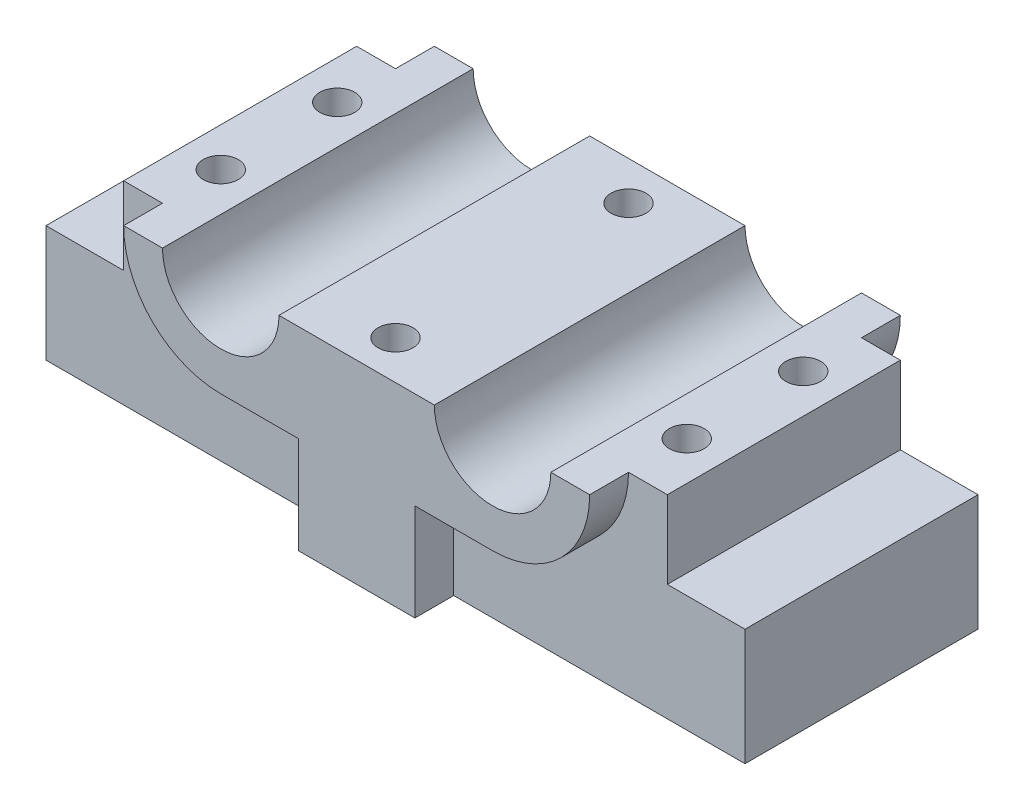
ISO-10303-21;
HEADER;
FILE_DESCRIPTION(('STEP AP214'),'2;1');
FILE_NAME('part.step','',(''),(''),'','','');
FILE_SCHEMA(('AUTOMOTIVE_DESIGN { 1 0 10303 214 1 1 1 1 }'));
ENDSEC;
DATA;
#1=APPLICATION_CONTEXT('core data for automotive mechanical design processes');
#2=APPLICATION_PROTOCOL_DEFINITION('international standard','automotive_design',2000,#1);
#3=PRODUCT_CONTEXT('',#1,'mechanical');
#4=PRODUCT('Part','Part','',(#3));
#5=PRODUCT_RELATED_PRODUCT_CATEGORY('part','',(#4));
#6=PRODUCT_DEFINITION_FORMATION('','',#4);
#7=PRODUCT_DEFINITION_CONTEXT('part definition',#1,'design');
#8=PRODUCT_DEFINITION('design','',#6,#7);
#9=PRODUCT_DEFINITION_SHAPE('','',#8);
#10=(LENGTH_UNIT() NAMED_UNIT(*) SI_UNIT(.MILLI.,.METRE.));
#11=(NAMED_UNIT(*) PLANE_ANGLE_UNIT() SI_UNIT($,.RADIAN.));
#12=(NAMED_UNIT(*) SI_UNIT($,.STERADIAN.) SOLID_ANGLE_UNIT());
#13=UNCERTAINTY_MEASURE_WITH_UNIT(LENGTH_MEASURE(1.E-05),#10,'distance_accuracy_value','');
#14=(GEOMETRIC_REPRESENTATION_CONTEXT(3) GLOBAL_UNCERTAINTY_ASSIGNED_CONTEXT((#13)) GLOBAL_UNIT_ASSIGNED_CONTEXT((#10,
#11,#12)) REPRESENTATION_CONTEXT('',''));
#15=CARTESIAN_POINT('',(0.,0.,0.));
#16=DIRECTION('',(0.,0.,1.));
#17=DIRECTION('',(1.,0.,0.));
#18=AXIS2_PLACEMENT_3D('',#15,#16,#17);
#19=CARTESIAN_POINT('',(-45.,12.5,20.));
#20=DIRECTION('',(0.,-1.,0.));
#21=DIRECTION('',(1.,0.,0.));
#22=AXIS2_PLACEMENT_3D('',#19,#20,#21);
#23=PLANE('',#22);
#24=DIRECTION('',(-1.,0.,0.));
#25=VECTOR('',#24,1.);
#26=CARTESIAN_POINT('',(-45.,12.5,20.));
#27=LINE('',#26,#25);
#28=CARTESIAN_POINT('',(-25.,12.5,20.));
#29=VERTEX_POINT('',#28);
#30=CARTESIAN_POINT('',(-30.,12.5,20.));
#31=VERTEX_POINT('',#30);
#32=EDGE_CURVE('E262',#29,#31,#27,.T.);
#33=ORIENTED_EDGE('',*,*,#32,.F.);
#34=DIRECTION('',(0.,0.,1.));
#35=VECTOR('',#34,1.);
#36=CARTESIAN_POINT('',(-25.,12.5,-20.));
#37=LINE('',#36,#35);
#38=CARTESIAN_POINT('',(-25.,12.5,-20.));
#39=VERTEX_POINT('',#38);
#40=EDGE_CURVE('E61',#39,#29,#37,.T.);
#41=ORIENTED_EDGE('',*,*,#40,.F.);
#42=DIRECTION('',(-1.,0.,0.));
#43=VECTOR('',#42,1.);
#44=CARTESIAN_POINT('',(-45.,12.5,-20.));
#45=LINE('',#44,#43);
#46=CARTESIAN_POINT('',(-30.,12.5,-20.));
#47=VERTEX_POINT('',#46);
#48=EDGE_CURVE('E258',#39,#47,#45,.T.);
#49=ORIENTED_EDGE('',*,*,#48,.T.);
#50=DIRECTION('',(0.,0.,-1.));
#51=VECTOR('',#50,1.);
#52=CARTESIAN_POINT('',(-30.,12.5,-15.));
#53=LINE('',#52,#51);
#54=CARTESIAN_POINT('',(-30.,12.5,-15.));
#55=VERTEX_POINT('',#54);
#56=EDGE_CURVE('E346',#55,#47,#53,.T.);
#57=ORIENTED_EDGE('',*,*,#56,.F.);
#58=DIRECTION('',(-1.,0.,0.));
#59=VECTOR('',#58,1.);
#60=CARTESIAN_POINT('',(-35.,12.5,-15.));
#61=LINE('',#60,#59);
#62=CARTESIAN_POINT('',(-35.,12.5,-15.));
#63=VERTEX_POINT('',#62);
#64=EDGE_CURVE('E394',#55,#63,#61,.T.);
#65=ORIENTED_EDGE('',*,*,#64,.T.);
#66=DIRECTION('',(0.,0.,1.));
#67=VECTOR('',#66,1.);
#68=CARTESIAN_POINT('',(-35.,12.5,-20.));
#69=LINE('',#68,#67);
#70=CARTESIAN_POINT('',(-35.,12.5,15.));
#71=VERTEX_POINT('',#70);
#72=EDGE_CURVE('E266',#63,#71,#69,.T.);
#73=ORIENTED_EDGE('',*,*,#72,.T.);
#74=DIRECTION('',(-1.,0.,0.));
#75=VECTOR('',#74,1.);
#76=CARTESIAN_POINT('',(-35.,12.5,15.));
#77=LINE('',#76,#75);
#78=CARTESIAN_POINT('',(-30.,12.5,15.));
#79=VERTEX_POINT('',#78);
#80=EDGE_CURVE('E517',#79,#71,#77,.T.);
#81=ORIENTED_EDGE('',*,*,#80,.F.);
#82=DIRECTION('',(0.,0.,1.));
#83=VECTOR('',#82,1.);
#84=CARTESIAN_POINT('',(-30.,12.5,15.));
#85=LINE('',#84,#83);
#86=EDGE_CURVE('E472',#79,#31,#85,.T.);
#87=ORIENTED_EDGE('',*,*,#86,.T.);
#88=EDGE_LOOP('',(#33,#41,#49,#57,#65,#73,#81,#87));
#89=FACE_BOUND('',#88,.T.);
#90=CARTESIAN_POINT('',(-30.,12.5,7.5));
#91=DIRECTION('',(0.,1.,0.));
#92=DIRECTION('',(0.,0.,1.));
#93=AXIS2_PLACEMENT_3D('',#90,#91,#92);
#94=CIRCLE('',#93,2.25000000000001);
#95=CARTESIAN_POINT('',(-30.,12.5,9.75000000000001));
#96=VERTEX_POINT('',#95);
#97=EDGE_CURVE('E681',#96,#96,#94,.T.);
#98=ORIENTED_EDGE('',*,*,#97,.F.);
#99=EDGE_LOOP('',(#98));
#100=FACE_BOUND('',#99,.T.);
#101=CARTESIAN_POINT('',(-30.,12.5,-7.5));
#102=DIRECTION('',(0.,1.,0.));
#103=DIRECTION('',(0.,0.,1.));
#104=AXIS2_PLACEMENT_3D('',#101,#102,#103);
#105=CIRCLE('',#104,2.25000000000001);
#106=CARTESIAN_POINT('',(-30.,12.5,-5.24999999999999));
#107=VERTEX_POINT('',#106);
#108=EDGE_CURVE('E660',#107,#107,#105,.T.);
#109=ORIENTED_EDGE('',*,*,#108,.F.);
#110=EDGE_LOOP('',(#109));
#111=FACE_BOUND('',#110,.T.);
#112=ADVANCED_FACE('F45',(#89,#100,#111),#23,.F.);
#113=CARTESIAN_POINT('',(30.,12.5,-7.5));
#114=DIRECTION('',(0.,1.,0.));
#115=DIRECTION('',(0.,0.,1.));
#116=AXIS2_PLACEMENT_3D('',#113,#114,#115);
#117=CIRCLE('',#116,2.25000000000001);
#118=CARTESIAN_POINT('',(30.,12.5,-5.24999999999999));
#119=VERTEX_POINT('',#118);
#120=EDGE_CURVE('E673',#119,#119,#117,.T.);
#121=ORIENTED_EDGE('',*,*,#120,.F.);
#122=EDGE_LOOP('',(#121));
#123=FACE_BOUND('',#122,.T.);
#124=CARTESIAN_POINT('',(30.,12.5,7.5));
#125=DIRECTION('',(0.,1.,0.));
#126=DIRECTION('',(0.,0.,1.));
#127=AXIS2_PLACEMENT_3D('',#124,#125,#126);
#128=CIRCLE('',#127,2.25000000000001);
#129=CARTESIAN_POINT('',(30.,12.5,9.75000000000001));
#130=VERTEX_POINT('',#129);
#131=EDGE_CURVE('E689',#130,#130,#128,.T.);
#132=ORIENTED_EDGE('',*,*,#131,.F.);
#133=EDGE_LOOP('',(#132));
#134=FACE_BOUND('',#133,.T.);
#135=CARTESIAN_POINT('',(30.,12.5,-20.));
#136=VERTEX_POINT('',#135);
#137=CARTESIAN_POINT('',(25.,12.5,-20.));
#138=VERTEX_POINT('',#137);
#139=EDGE_CURVE('E245',#136,#138,#45,.T.);
#140=ORIENTED_EDGE('',*,*,#139,.T.);
#141=DIRECTION('',(0.,0.,1.));
#142=VECTOR('',#141,1.);
#143=CARTESIAN_POINT('',(25.,12.5,-20.));
#144=LINE('',#143,#142);
#145=CARTESIAN_POINT('',(25.,12.5,20.));
#146=VERTEX_POINT('',#145);
#147=EDGE_CURVE('E229',#138,#146,#144,.T.);
#148=ORIENTED_EDGE('',*,*,#147,.T.);
#149=CARTESIAN_POINT('',(30.,12.5,20.));
#150=VERTEX_POINT('',#149);
#151=EDGE_CURVE('E297',#150,#146,#27,.T.);
#152=ORIENTED_EDGE('',*,*,#151,.F.);
#153=DIRECTION('',(0.,0.,1.));
#154=VECTOR('',#153,1.);
#155=CARTESIAN_POINT('',(30.,12.5,15.));
#156=LINE('',#155,#154);
#157=CARTESIAN_POINT('',(30.,12.5,15.));
#158=VERTEX_POINT('',#157);
#159=EDGE_CURVE('E296',#158,#150,#156,.T.);
#160=ORIENTED_EDGE('',*,*,#159,.F.);
#161=DIRECTION('',(-1.,0.,0.));
#162=VECTOR('',#161,1.);
#163=CARTESIAN_POINT('',(35.,12.5,15.));
#164=LINE('',#163,#162);
#165=CARTESIAN_POINT('',(35.,12.5,15.));
#166=VERTEX_POINT('',#165);
#167=EDGE_CURVE('E446',#166,#158,#164,.T.);
#168=ORIENTED_EDGE('',*,*,#167,.F.);
#169=DIRECTION('',(0.,0.,1.));
#170=VECTOR('',#169,1.);
#171=CARTESIAN_POINT('',(35.,12.5,-20.));
#172=LINE('',#171,#170);
#173=CARTESIAN_POINT('',(35.,12.5,-15.));
#174=VERTEX_POINT('',#173);
#175=EDGE_CURVE('E287',#174,#166,#172,.T.);
#176=ORIENTED_EDGE('',*,*,#175,.F.);
#177=DIRECTION('',(-1.,0.,0.));
#178=VECTOR('',#177,1.);
#179=CARTESIAN_POINT('',(35.,12.5,-15.));
#180=LINE('',#179,#178);
#181=CARTESIAN_POINT('',(30.,12.5,-15.));
#182=VERTEX_POINT('',#181);
#183=EDGE_CURVE('E557',#174,#182,#180,.T.);
#184=ORIENTED_EDGE('',*,*,#183,.T.);
#185=DIRECTION('',(0.,0.,-1.));
#186=VECTOR('',#185,1.);
#187=CARTESIAN_POINT('',(30.,12.5,-15.));
#188=LINE('',#187,#186);
#189=EDGE_CURVE('E254',#182,#136,#188,.T.);
#190=ORIENTED_EDGE('',*,*,#189,.T.);
#191=EDGE_LOOP('',(#140,#148,#152,#160,#168,#176,#184,#190));
#192=FACE_BOUND('',#191,.T.);
#193=ADVANCED_FACE('F252',(#123,#134,#192),#23,.F.);
#194=CARTESIAN_POINT('',(0.,12.5,15.));
#195=DIRECTION('',(0.,1.,0.));
#196=DIRECTION('',(0.,0.,1.));
#197=AXIS2_PLACEMENT_3D('',#194,#195,#196);
#198=CIRCLE('',#197,2.25000000000001);
#199=CARTESIAN_POINT('',(0.,12.5,17.25));
#200=VERTEX_POINT('',#199);
#201=EDGE_CURVE('E648',#200,#200,#198,.T.);
#202=ORIENTED_EDGE('',*,*,#201,.F.);
#203=EDGE_LOOP('',(#202));
#204=FACE_BOUND('',#203,.T.);
#205=CARTESIAN_POINT('',(0.,12.5,-15.));
#206=DIRECTION('',(0.,1.,0.));
#207=DIRECTION('',(0.,0.,1.));
#208=AXIS2_PLACEMENT_3D('',#205,#206,#207);
#209=CIRCLE('',#208,2.25000000000001);
#210=CARTESIAN_POINT('',(0.,12.5,-12.75));
#211=VERTEX_POINT('',#210);
#212=EDGE_CURVE('E651',#211,#211,#209,.T.);
#213=ORIENTED_EDGE('',*,*,#212,.F.);
#214=EDGE_LOOP('',(#213));
#215=FACE_BOUND('',#214,.T.);
#216=CARTESIAN_POINT('',(9.99999999999998,12.5,20.));
#217=VERTEX_POINT('',#216);
#218=CARTESIAN_POINT('',(-10.,12.5,20.));
#219=VERTEX_POINT('',#218);
#220=EDGE_CURVE('E300',#217,#219,#27,.T.);
#221=ORIENTED_EDGE('',*,*,#220,.F.);
#222=DIRECTION('',(0.,0.,1.));
#223=VECTOR('',#222,1.);
#224=CARTESIAN_POINT('',(10.,12.5,-20.));
#225=LINE('',#224,#223);
#226=CARTESIAN_POINT('',(10.,12.5,-20.));
#227=VERTEX_POINT('',#226);
#228=EDGE_CURVE('E69',#227,#217,#225,.T.);
#229=ORIENTED_EDGE('',*,*,#228,.F.);
#230=CARTESIAN_POINT('',(-10.,12.5,-20.));
#231=VERTEX_POINT('',#230);
#232=EDGE_CURVE('E248',#227,#231,#45,.T.);
#233=ORIENTED_EDGE('',*,*,#232,.T.);
#234=DIRECTION('',(0.,0.,1.));
#235=VECTOR('',#234,1.);
#236=CARTESIAN_POINT('',(-10.,12.5,-20.));
#237=LINE('',#236,#235);
#238=EDGE_CURVE('E541',#231,#219,#237,.T.);
#239=ORIENTED_EDGE('',*,*,#238,.T.);
#240=EDGE_LOOP('',(#221,#229,#233,#239));
#241=FACE_BOUND('',#240,.T.);
#242=ADVANCED_FACE('F540',(#204,#215,#241),#23,.F.);
#243=CARTESIAN_POINT('',(-45.,12.5,20.));
#244=DIRECTION('',(1.,0.,0.));
#245=DIRECTION('',(0.,0.,-1.));
#246=AXIS2_PLACEMENT_3D('',#243,#244,#245);
#247=PLANE('',#246);
#248=DIRECTION('',(0.,-1.,0.));
#249=VECTOR('',#248,1.);
#250=CARTESIAN_POINT('',(-45.,-12.5,-15.));
#251=LINE('',#250,#249);
#252=CARTESIAN_POINT('',(-45.,2.5,-15.));
#253=VERTEX_POINT('',#252);
#254=CARTESIAN_POINT('',(-45.,-12.5,-15.));
#255=VERTEX_POINT('',#254);
#256=EDGE_CURVE('E382',#253,#255,#251,.T.);
#257=ORIENTED_EDGE('',*,*,#256,.T.);
#258=DIRECTION('',(0.,0.,-1.));
#259=VECTOR('',#258,1.);
#260=CARTESIAN_POINT('',(-45.,-12.5,20.));
#261=LINE('',#260,#259);
#262=CARTESIAN_POINT('',(-45.,-12.5,15.));
#263=VERTEX_POINT('',#262);
#264=EDGE_CURVE('E11',#263,#255,#261,.T.);
#265=ORIENTED_EDGE('',*,*,#264,.F.);
#266=DIRECTION('',(0.,-1.,0.));
#267=VECTOR('',#266,1.);
#268=CARTESIAN_POINT('',(-45.,-12.5,15.));
#269=LINE('',#268,#267);
#270=CARTESIAN_POINT('',(-45.,2.5,15.));
#271=VERTEX_POINT('',#270);
#272=EDGE_CURVE('E507',#271,#263,#269,.T.);
#273=ORIENTED_EDGE('',*,*,#272,.F.);
#274=DIRECTION('',(0.,0.,1.));
#275=VECTOR('',#274,1.);
#276=CARTESIAN_POINT('',(-45.,2.5,-20.));
#277=LINE('',#276,#275);
#278=EDGE_CURVE('E279',#253,#271,#277,.T.);
#279=ORIENTED_EDGE('',*,*,#278,.F.);
#280=EDGE_LOOP('',(#257,#265,#273,#279));
#281=FACE_BOUND('',#280,.T.);
#282=ADVANCED_FACE('F596',(#281),#247,.F.);
#283=CARTESIAN_POINT('',(-35.,12.5,-20.));
#284=DIRECTION('',(1.,0.,0.));
#285=DIRECTION('',(0.,0.,-1.));
#286=AXIS2_PLACEMENT_3D('',#283,#284,#285);
#287=PLANE('',#286);
#288=DIRECTION('',(0.,-1.,0.));
#289=VECTOR('',#288,1.);
#290=CARTESIAN_POINT('',(-35.,2.5,-15.));
#291=LINE('',#290,#289);
#292=CARTESIAN_POINT('',(-35.,2.5,-15.));
#293=VERTEX_POINT('',#292);
#294=EDGE_CURVE('E390',#63,#293,#291,.T.);
#295=ORIENTED_EDGE('',*,*,#294,.T.);
#296=DIRECTION('',(0.,0.,1.));
#297=VECTOR('',#296,1.);
#298=CARTESIAN_POINT('',(-35.,2.5,-20.));
#299=LINE('',#298,#297);
#300=CARTESIAN_POINT('',(-35.,2.5,15.));
#301=VERTEX_POINT('',#300);
#302=EDGE_CURVE('E272',#293,#301,#299,.T.);
#303=ORIENTED_EDGE('',*,*,#302,.T.);
#304=DIRECTION('',(0.,-1.,0.));
#305=VECTOR('',#304,1.);
#306=CARTESIAN_POINT('',(-35.,2.5,15.));
#307=LINE('',#306,#305);
#308=EDGE_CURVE('E514',#71,#301,#307,.T.);
#309=ORIENTED_EDGE('',*,*,#308,.F.);
#310=ORIENTED_EDGE('',*,*,#72,.F.);
#311=EDGE_LOOP('',(#295,#303,#309,#310));
#312=FACE_BOUND('',#311,.T.);
#313=ADVANCED_FACE('F644',(#312),#287,.F.);
#314=CARTESIAN_POINT('',(-45.,2.5,-20.));
#315=DIRECTION('',(0.,-1.,0.));
#316=DIRECTION('',(0.,0.,-1.));
#317=AXIS2_PLACEMENT_3D('',#314,#315,#316);
#318=PLANE('',#317);
#319=DIRECTION('',(-1.,0.,0.));
#320=VECTOR('',#319,1.);
#321=CARTESIAN_POINT('',(-45.,2.5,-15.));
#322=LINE('',#321,#320);
#323=EDGE_CURVE('E386',#293,#253,#322,.T.);
#324=ORIENTED_EDGE('',*,*,#323,.T.);
#325=ORIENTED_EDGE('',*,*,#278,.T.);
#326=DIRECTION('',(-1.,0.,0.));
#327=VECTOR('',#326,1.);
#328=CARTESIAN_POINT('',(-45.,2.5,15.));
#329=LINE('',#328,#327);
#330=EDGE_CURVE('E510',#301,#271,#329,.T.);
#331=ORIENTED_EDGE('',*,*,#330,.F.);
#332=ORIENTED_EDGE('',*,*,#302,.F.);
#333=EDGE_LOOP('',(#324,#325,#331,#332));
#334=FACE_BOUND('',#333,.T.);
#335=ADVANCED_FACE('F753',(#334),#318,.F.);
#336=CARTESIAN_POINT('',(-45.,-12.5,20.));
#337=DIRECTION('',(0.,1.,0.));
#338=DIRECTION('',(0.,0.,1.));
#339=AXIS2_PLACEMENT_3D('',#336,#337,#338);
#340=PLANE('',#339);
#341=CARTESIAN_POINT('',(0.,-12.5,15.));
#342=DIRECTION('',(0.,1.,0.));
#343=DIRECTION('',(0.,0.,1.));
#344=AXIS2_PLACEMENT_3D('',#341,#342,#343);
#345=CIRCLE('',#344,2.25000000000001);
#346=CARTESIAN_POINT('',(0.,-12.5,17.25));
#347=VERTEX_POINT('',#346);
#348=EDGE_CURVE('E655',#347,#347,#345,.T.);
#349=ORIENTED_EDGE('',*,*,#348,.T.);
#350=EDGE_LOOP('',(#349));
#351=FACE_BOUND('',#350,.T.);
#352=CARTESIAN_POINT('',(0.,-12.5,-15.));
#353=DIRECTION('',(0.,1.,0.));
#354=DIRECTION('',(0.,0.,1.));
#355=AXIS2_PLACEMENT_3D('',#352,#353,#354);
#356=CIRCLE('',#355,2.25000000000001);
#357=CARTESIAN_POINT('',(0.,-12.5,-12.75));
#358=VERTEX_POINT('',#357);
#359=EDGE_CURVE('E654',#358,#358,#356,.T.);
#360=ORIENTED_EDGE('',*,*,#359,.T.);
#361=EDGE_LOOP('',(#360));
#362=FACE_BOUND('',#361,.T.);
#363=CARTESIAN_POINT('',(-30.,-12.5,-7.5));
#364=DIRECTION('',(0.,1.,0.));
#365=DIRECTION('',(0.,0.,1.));
#366=AXIS2_PLACEMENT_3D('',#363,#364,#365);
#367=CIRCLE('',#366,2.25000000000001);
#368=CARTESIAN_POINT('',(-30.,-12.5,-5.24999999999999));
#369=VERTEX_POINT('',#368);
#370=EDGE_CURVE('E669',#369,#369,#367,.T.);
#371=ORIENTED_EDGE('',*,*,#370,.T.);
#372=EDGE_LOOP('',(#371));
#373=FACE_BOUND('',#372,.T.);
#374=CARTESIAN_POINT('',(30.,-12.5,-7.5));
#375=DIRECTION('',(0.,1.,0.));
#376=DIRECTION('',(0.,0.,1.));
#377=AXIS2_PLACEMENT_3D('',#374,#375,#376);
#378=CIRCLE('',#377,2.25000000000001);
#379=CARTESIAN_POINT('',(30.,-12.5,-5.24999999999999));
#380=VERTEX_POINT('',#379);
#381=EDGE_CURVE('E677',#380,#380,#378,.T.);
#382=ORIENTED_EDGE('',*,*,#381,.T.);
#383=EDGE_LOOP('',(#382));
#384=FACE_BOUND('',#383,.T.);
#385=CARTESIAN_POINT('',(-30.,-12.5,7.5));
#386=DIRECTION('',(0.,1.,0.));
#387=DIRECTION('',(0.,0.,1.));
#388=AXIS2_PLACEMENT_3D('',#385,#386,#387);
#389=CIRCLE('',#388,2.25000000000001);
#390=CARTESIAN_POINT('',(-30.,-12.5,9.75000000000001));
#391=VERTEX_POINT('',#390);
#392=EDGE_CURVE('E685',#391,#391,#389,.T.);
#393=ORIENTED_EDGE('',*,*,#392,.T.);
#394=EDGE_LOOP('',(#393));
#395=FACE_BOUND('',#394,.T.);
#396=CARTESIAN_POINT('',(30.,-12.5,7.5));
#397=DIRECTION('',(0.,1.,0.));
#398=DIRECTION('',(0.,0.,1.));
#399=AXIS2_PLACEMENT_3D('',#396,#397,#398);
#400=CIRCLE('',#399,2.25000000000001);
#401=CARTESIAN_POINT('',(30.,-12.5,9.75000000000001));
#402=VERTEX_POINT('',#401);
#403=EDGE_CURVE('E548',#402,#402,#400,.T.);
#404=ORIENTED_EDGE('',*,*,#403,.T.);
#405=EDGE_LOOP('',(#404));
#406=FACE_BOUND('',#405,.T.);
#407=DIRECTION('',(0.,0.,-1.));
#408=VECTOR('',#407,1.);
#409=CARTESIAN_POINT('',(7.5,-12.5,-15.));
#410=LINE('',#409,#408);
#411=CARTESIAN_POINT('',(7.5,-12.5,-15.));
#412=VERTEX_POINT('',#411);
#413=CARTESIAN_POINT('',(7.5,-12.5,-20.));
#414=VERTEX_POINT('',#413);
#415=EDGE_CURVE('E326',#412,#414,#410,.T.);
#416=ORIENTED_EDGE('',*,*,#415,.F.);
#417=DIRECTION('',(1.,0.,0.));
#418=VECTOR('',#417,1.);
#419=CARTESIAN_POINT('',(7.5,-12.5,-15.));
#420=LINE('',#419,#418);
#421=CARTESIAN_POINT('',(45.,-12.5,-15.));
#422=VERTEX_POINT('',#421);
#423=EDGE_CURVE('E325',#412,#422,#420,.T.);
#424=ORIENTED_EDGE('',*,*,#423,.T.);
#425=DIRECTION('',(0.,0.,-1.));
#426=VECTOR('',#425,1.);
#427=CARTESIAN_POINT('',(45.,-12.5,20.));
#428=LINE('',#427,#426);
#429=CARTESIAN_POINT('',(45.,-12.5,15.));
#430=VERTEX_POINT('',#429);
#431=EDGE_CURVE('E54',#430,#422,#428,.T.);
#432=ORIENTED_EDGE('',*,*,#431,.F.);
#433=DIRECTION('',(1.,0.,0.));
#434=VECTOR('',#433,1.);
#435=CARTESIAN_POINT('',(7.5,-12.5,15.));
#436=LINE('',#435,#434);
#437=CARTESIAN_POINT('',(7.5,-12.5,15.));
#438=VERTEX_POINT('',#437);
#439=EDGE_CURVE('E323',#438,#430,#436,.T.);
#440=ORIENTED_EDGE('',*,*,#439,.F.);
#441=DIRECTION('',(0.,0.,1.));
#442=VECTOR('',#441,1.);
#443=CARTESIAN_POINT('',(7.5,-12.5,15.));
#444=LINE('',#443,#442);
#445=CARTESIAN_POINT('',(7.5,-12.5,20.));
#446=VERTEX_POINT('',#445);
#447=EDGE_CURVE('E464',#438,#446,#444,.T.);
#448=ORIENTED_EDGE('',*,*,#447,.T.);
#449=DIRECTION('',(1.,0.,0.));
#450=VECTOR('',#449,1.);
#451=CARTESIAN_POINT('',(-45.,-12.5,20.));
#452=LINE('',#451,#450);
#453=CARTESIAN_POINT('',(-7.5,-12.5,20.));
#454=VERTEX_POINT('',#453);
#455=EDGE_CURVE('E299',#454,#446,#452,.T.);
#456=ORIENTED_EDGE('',*,*,#455,.F.);
#457=DIRECTION('',(0.,0.,1.));
#458=VECTOR('',#457,1.);
#459=CARTESIAN_POINT('',(-7.5,-12.5,15.));
#460=LINE('',#459,#458);
#461=CARTESIAN_POINT('',(-7.5,-12.5,15.));
#462=VERTEX_POINT('',#461);
#463=EDGE_CURVE('E477',#462,#454,#460,.T.);
#464=ORIENTED_EDGE('',*,*,#463,.F.);
#465=DIRECTION('',(1.,0.,0.));
#466=VECTOR('',#465,1.);
#467=CARTESIAN_POINT('',(-7.5,-12.5,15.));
#468=LINE('',#467,#466);
#469=EDGE_CURVE('E503',#263,#462,#468,.T.);
#470=ORIENTED_EDGE('',*,*,#469,.F.);
#471=ORIENTED_EDGE('',*,*,#264,.T.);
#472=DIRECTION('',(1.,0.,0.));
#473=VECTOR('',#472,1.);
#474=CARTESIAN_POINT('',(-7.5,-12.5,-15.));
#475=LINE('',#474,#473);
#476=CARTESIAN_POINT('',(-7.5,-12.5,-15.));
#477=VERTEX_POINT('',#476);
#478=EDGE_CURVE('E378',#255,#477,#475,.T.);
#479=ORIENTED_EDGE('',*,*,#478,.T.);
#480=DIRECTION('',(0.,0.,-1.));
#481=VECTOR('',#480,1.);
#482=CARTESIAN_POINT('',(-7.5,-12.5,-15.));
#483=LINE('',#482,#481);
#484=CARTESIAN_POINT('',(-7.5,-12.5,-20.));
#485=VERTEX_POINT('',#484);
#486=EDGE_CURVE('E411',#477,#485,#483,.T.);
#487=ORIENTED_EDGE('',*,*,#486,.T.);
#488=DIRECTION('',(1.,0.,0.));
#489=VECTOR('',#488,1.);
#490=CARTESIAN_POINT('',(-45.,-12.5,-20.));
#491=LINE('',#490,#489);
#492=EDGE_CURVE('E256',#485,#414,#491,.T.);
#493=ORIENTED_EDGE('',*,*,#492,.T.);
#494=EDGE_LOOP('',(#416,#424,#432,#440,#448,#456,#464,#470,#471,#479,#487,#493));
#495=FACE_BOUND('',#494,.T.);
#496=ADVANCED_FACE('F321',(#351,#362,#373,#384,#395,#406,#495),#340,.F.);
#497=CARTESIAN_POINT('',(0.,0.,-20.));
#498=DIRECTION('',(0.,0.,1.));
#499=DIRECTION('',(1.,0.,0.));
#500=AXIS2_PLACEMENT_3D('',#497,#498,#499);
#501=PLANE('',#500);
#502=ORIENTED_EDGE('',*,*,#232,.F.);
#503=CARTESIAN_POINT('',(17.5,12.5,-20.));
#504=DIRECTION('',(0.,0.,1.));
#505=DIRECTION('',(-1.,0.,0.));
#506=AXIS2_PLACEMENT_3D('',#503,#504,#505);
#507=CIRCLE('',#506,7.5);
#508=EDGE_CURVE('E232',#227,#138,#507,.T.);
#509=ORIENTED_EDGE('',*,*,#508,.T.);
#510=ORIENTED_EDGE('',*,*,#139,.F.);
#511=CARTESIAN_POINT('',(17.5,12.5,-20.));
#512=DIRECTION('',(0.,0.,-1.));
#513=DIRECTION('',(-1.,0.,0.));
#514=AXIS2_PLACEMENT_3D('',#511,#512,#513);
#515=CIRCLE('',#514,12.5);
#516=CARTESIAN_POINT('',(17.5,0.,-20.));
#517=VERTEX_POINT('',#516);
#518=EDGE_CURVE('E342',#136,#517,#515,.T.);
#519=ORIENTED_EDGE('',*,*,#518,.T.);
#520=DIRECTION('',(-1.,0.,0.));
#521=VECTOR('',#520,1.);
#522=CARTESIAN_POINT('',(17.5,0.,-20.));
#523=LINE('',#522,#521);
#524=CARTESIAN_POINT('',(7.5,0.,-20.));
#525=VERTEX_POINT('',#524);
#526=EDGE_CURVE('E350',#517,#525,#523,.T.);
#527=ORIENTED_EDGE('',*,*,#526,.T.);
#528=DIRECTION('',(0.,-1.,0.));
#529=VECTOR('',#528,1.);
#530=CARTESIAN_POINT('',(7.5,0.,-20.));
#531=LINE('',#530,#529);
#532=EDGE_CURVE('E345',#525,#414,#531,.T.);
#533=ORIENTED_EDGE('',*,*,#532,.T.);
#534=ORIENTED_EDGE('',*,*,#492,.F.);
#535=DIRECTION('',(0.,1.,0.));
#536=VECTOR('',#535,1.);
#537=CARTESIAN_POINT('',(-7.5,0.,-20.));
#538=LINE('',#537,#536);
#539=CARTESIAN_POINT('',(-7.5,0.,-20.));
#540=VERTEX_POINT('',#539);
#541=EDGE_CURVE('E372',#485,#540,#538,.T.);
#542=ORIENTED_EDGE('',*,*,#541,.T.);
#543=DIRECTION('',(-1.,0.,0.));
#544=VECTOR('',#543,1.);
#545=CARTESIAN_POINT('',(-17.5,0.,-20.));
#546=LINE('',#545,#544);
#547=CARTESIAN_POINT('',(-17.5,0.,-20.));
#548=VERTEX_POINT('',#547);
#549=EDGE_CURVE('E402',#540,#548,#546,.T.);
#550=ORIENTED_EDGE('',*,*,#549,.T.);
#551=CARTESIAN_POINT('',(-17.5,12.5,-20.));
#552=DIRECTION('',(0.,0.,-1.));
#553=DIRECTION('',(1.,0.,0.));
#554=AXIS2_PLACEMENT_3D('',#551,#552,#553);
#555=CIRCLE('',#554,12.5);
#556=EDGE_CURVE('E398',#548,#47,#555,.T.);
#557=ORIENTED_EDGE('',*,*,#556,.T.);
#558=ORIENTED_EDGE('',*,*,#48,.F.);
#559=CARTESIAN_POINT('',(-17.5,12.5,-20.));
#560=DIRECTION('',(0.,0.,1.));
#561=DIRECTION('',(1.,0.,0.));
#562=AXIS2_PLACEMENT_3D('',#559,#560,#561);
#563=CIRCLE('',#562,7.5);
#564=EDGE_CURVE('E543',#39,#231,#563,.T.);
#565=ORIENTED_EDGE('',*,*,#564,.T.);
#566=EDGE_LOOP('',(#502,#509,#510,#519,#527,#533,#534,#542,#550,#557,#558,#565));
#567=FACE_BOUND('',#566,.T.);
#568=ADVANCED_FACE('F243',(#567),#501,.F.);
#569=CARTESIAN_POINT('',(45.,12.5,20.));
#570=DIRECTION('',(-1.,0.,0.));
#571=DIRECTION('',(0.,-1.,0.));
#572=AXIS2_PLACEMENT_3D('',#569,#570,#571);
#573=PLANE('',#572);
#574=ORIENTED_EDGE('',*,*,#431,.T.);
#575=DIRECTION('',(0.,1.,0.));
#576=VECTOR('',#575,1.);
#577=CARTESIAN_POINT('',(45.,-12.5,-15.));
#578=LINE('',#577,#576);
#579=CARTESIAN_POINT('',(45.,2.5,-15.));
#580=VERTEX_POINT('',#579);
#581=EDGE_CURVE('E313',#422,#580,#578,.T.);
#582=ORIENTED_EDGE('',*,*,#581,.T.);
#583=DIRECTION('',(0.,0.,1.));
#584=VECTOR('',#583,1.);
#585=CARTESIAN_POINT('',(45.,2.5,-20.));
#586=LINE('',#585,#584);
#587=CARTESIAN_POINT('',(45.,2.5,15.));
#588=VERTEX_POINT('',#587);
#589=EDGE_CURVE('E293',#580,#588,#586,.T.);
#590=ORIENTED_EDGE('',*,*,#589,.T.);
#591=DIRECTION('',(0.,1.,0.));
#592=VECTOR('',#591,1.);
#593=CARTESIAN_POINT('',(45.,-12.5,15.));
#594=LINE('',#593,#592);
#595=EDGE_CURVE('E316',#430,#588,#594,.T.);
#596=ORIENTED_EDGE('',*,*,#595,.F.);
#597=EDGE_LOOP('',(#574,#582,#590,#596));
#598=FACE_BOUND('',#597,.T.);
#599=ADVANCED_FACE('F47',(#598),#573,.F.);
#600=CARTESIAN_POINT('',(0.,0.,20.));
#601=DIRECTION('',(0.,0.,1.));
#602=DIRECTION('',(1.,0.,0.));
#603=AXIS2_PLACEMENT_3D('',#600,#601,#602);
#604=PLANE('',#603);
#605=CARTESIAN_POINT('',(17.5,12.5,20.));
#606=DIRECTION('',(0.,0.,1.));
#607=DIRECTION('',(-1.,0.,0.));
#608=AXIS2_PLACEMENT_3D('',#605,#606,#607);
#609=CIRCLE('',#608,7.5);
#610=EDGE_CURVE('E233',#217,#146,#609,.T.);
#611=ORIENTED_EDGE('',*,*,#610,.F.);
#612=ORIENTED_EDGE('',*,*,#220,.T.);
#613=CARTESIAN_POINT('',(-17.5,12.5,20.));
#614=DIRECTION('',(0.,0.,1.));
#615=DIRECTION('',(1.,0.,0.));
#616=AXIS2_PLACEMENT_3D('',#613,#614,#615);
#617=CIRCLE('',#616,7.5);
#618=EDGE_CURVE('E534',#29,#219,#617,.T.);
#619=ORIENTED_EDGE('',*,*,#618,.F.);
#620=ORIENTED_EDGE('',*,*,#32,.T.);
#621=CARTESIAN_POINT('',(-17.5,12.5,20.));
#622=DIRECTION('',(0.,0.,-1.));
#623=DIRECTION('',(1.,0.,0.));
#624=AXIS2_PLACEMENT_3D('',#621,#622,#623);
#625=CIRCLE('',#624,12.5);
#626=CARTESIAN_POINT('',(-17.5,0.,20.));
#627=VERTEX_POINT('',#626);
#628=EDGE_CURVE('E456',#627,#31,#625,.T.);
#629=ORIENTED_EDGE('',*,*,#628,.F.);
#630=DIRECTION('',(-1.,0.,0.));
#631=VECTOR('',#630,1.);
#632=CARTESIAN_POINT('',(-17.5,0.,20.));
#633=LINE('',#632,#631);
#634=CARTESIAN_POINT('',(-7.5,0.,20.));
#635=VERTEX_POINT('',#634);
#636=EDGE_CURVE('E485',#635,#627,#633,.T.);
#637=ORIENTED_EDGE('',*,*,#636,.F.);
#638=DIRECTION('',(0.,1.,0.));
#639=VECTOR('',#638,1.);
#640=CARTESIAN_POINT('',(-7.5,0.,20.));
#641=LINE('',#640,#639);
#642=EDGE_CURVE('E489',#454,#635,#641,.T.);
#643=ORIENTED_EDGE('',*,*,#642,.F.);
#644=ORIENTED_EDGE('',*,*,#455,.T.);
#645=DIRECTION('',(0.,-1.,0.));
#646=VECTOR('',#645,1.);
#647=CARTESIAN_POINT('',(7.5,0.,20.));
#648=LINE('',#647,#646);
#649=CARTESIAN_POINT('',(7.5,0.,20.));
#650=VERTEX_POINT('',#649);
#651=EDGE_CURVE('E426',#650,#446,#648,.T.);
#652=ORIENTED_EDGE('',*,*,#651,.F.);
#653=DIRECTION('',(-1.,0.,0.));
#654=VECTOR('',#653,1.);
#655=CARTESIAN_POINT('',(17.5,0.,20.));
#656=LINE('',#655,#654);
#657=CARTESIAN_POINT('',(17.5,0.,20.));
#658=VERTEX_POINT('',#657);
#659=EDGE_CURVE('E455',#658,#650,#656,.T.);
#660=ORIENTED_EDGE('',*,*,#659,.F.);
#661=CARTESIAN_POINT('',(17.5,12.5,20.));
#662=DIRECTION('',(0.,0.,-1.));
#663=DIRECTION('',(-1.,0.,0.));
#664=AXIS2_PLACEMENT_3D('',#661,#662,#663);
#665=CIRCLE('',#664,12.5);
#666=EDGE_CURVE('E451',#150,#658,#665,.T.);
#667=ORIENTED_EDGE('',*,*,#666,.F.);
#668=ORIENTED_EDGE('',*,*,#151,.T.);
#669=EDGE_LOOP('',(#611,#612,#619,#620,#629,#637,#643,#644,#652,#660,#667,#668));
#670=FACE_BOUND('',#669,.T.);
#671=ADVANCED_FACE('F532',(#670),#604,.T.);
#672=CARTESIAN_POINT('',(45.,2.5,-20.));
#673=DIRECTION('',(0.,-1.,0.));
#674=DIRECTION('',(1.,0.,0.));
#675=AXIS2_PLACEMENT_3D('',#672,#673,#674);
#676=PLANE('',#675);
#677=ORIENTED_EDGE('',*,*,#589,.F.);
#678=DIRECTION('',(-1.,0.,0.));
#679=VECTOR('',#678,1.);
#680=CARTESIAN_POINT('',(45.,2.5,-15.));
#681=LINE('',#680,#679);
#682=CARTESIAN_POINT('',(35.,2.5,-15.));
#683=VERTEX_POINT('',#682);
#684=EDGE_CURVE('E336',#580,#683,#681,.T.);
#685=ORIENTED_EDGE('',*,*,#684,.T.);
#686=DIRECTION('',(0.,0.,1.));
#687=VECTOR('',#686,1.);
#688=CARTESIAN_POINT('',(35.,2.5,-20.));
#689=LINE('',#688,#687);
#690=CARTESIAN_POINT('',(35.,2.5,15.));
#691=VERTEX_POINT('',#690);
#692=EDGE_CURVE('E290',#683,#691,#689,.T.);
#693=ORIENTED_EDGE('',*,*,#692,.T.);
#694=DIRECTION('',(-1.,0.,0.));
#695=VECTOR('',#694,1.);
#696=CARTESIAN_POINT('',(45.,2.5,15.));
#697=LINE('',#696,#695);
#698=EDGE_CURVE('E438',#588,#691,#697,.T.);
#699=ORIENTED_EDGE('',*,*,#698,.F.);
#700=EDGE_LOOP('',(#677,#685,#693,#699));
#701=FACE_BOUND('',#700,.T.);
#702=ADVANCED_FACE('F567',(#701),#676,.F.);
#703=CARTESIAN_POINT('',(35.,12.5,-20.));
#704=DIRECTION('',(-1.,0.,0.));
#705=DIRECTION('',(0.,0.,1.));
#706=AXIS2_PLACEMENT_3D('',#703,#704,#705);
#707=PLANE('',#706);
#708=ORIENTED_EDGE('',*,*,#692,.F.);
#709=DIRECTION('',(0.,1.,0.));
#710=VECTOR('',#709,1.);
#711=CARTESIAN_POINT('',(35.,2.5,-15.));
#712=LINE('',#711,#710);
#713=EDGE_CURVE('E560',#683,#174,#712,.T.);
#714=ORIENTED_EDGE('',*,*,#713,.T.);
#715=ORIENTED_EDGE('',*,*,#175,.T.);
#716=DIRECTION('',(0.,1.,0.));
#717=VECTOR('',#716,1.);
#718=CARTESIAN_POINT('',(35.,2.5,15.));
#719=LINE('',#718,#717);
#720=EDGE_CURVE('E442',#691,#166,#719,.T.);
#721=ORIENTED_EDGE('',*,*,#720,.F.);
#722=EDGE_LOOP('',(#708,#714,#715,#721));
#723=FACE_BOUND('',#722,.T.);
#724=ADVANCED_FACE('F571',(#723),#707,.F.);
#725=CARTESIAN_POINT('',(-17.5,12.5,15.));
#726=DIRECTION('',(0.,0.,1.));
#727=DIRECTION('',(1.,0.,0.));
#728=AXIS2_PLACEMENT_3D('',#725,#726,#727);
#729=CYLINDRICAL_SURFACE('',#728,12.5);
#730=ORIENTED_EDGE('',*,*,#628,.T.);
#731=ORIENTED_EDGE('',*,*,#86,.F.);
#732=CARTESIAN_POINT('',(-17.5,12.5,15.));
#733=DIRECTION('',(0.,0.,-1.));
#734=DIRECTION('',(1.,0.,0.));
#735=AXIS2_PLACEMENT_3D('',#732,#733,#734);
#736=CIRCLE('',#735,12.5);
#737=CARTESIAN_POINT('',(-17.5,0.,15.));
#738=VERTEX_POINT('',#737);
#739=EDGE_CURVE('E282',#738,#79,#736,.T.);
#740=ORIENTED_EDGE('',*,*,#739,.F.);
#741=DIRECTION('',(0.,0.,1.));
#742=VECTOR('',#741,1.);
#743=CARTESIAN_POINT('',(-17.5,0.,15.));
#744=LINE('',#743,#742);
#745=EDGE_CURVE('E359',#738,#627,#744,.T.);
#746=ORIENTED_EDGE('',*,*,#745,.T.);
#747=EDGE_LOOP('',(#730,#731,#740,#746));
#748=FACE_BOUND('',#747,.T.);
#749=ADVANCED_FACE('F529',(#748),#729,.T.);
#750=CARTESIAN_POINT('',(-17.5,0.,15.));
#751=DIRECTION('',(0.,1.,0.));
#752=DIRECTION('',(-1.,0.,0.));
#753=AXIS2_PLACEMENT_3D('',#750,#751,#752);
#754=PLANE('',#753);
#755=ORIENTED_EDGE('',*,*,#636,.T.);
#756=ORIENTED_EDGE('',*,*,#745,.F.);
#757=DIRECTION('',(-1.,0.,0.));
#758=VECTOR('',#757,1.);
#759=CARTESIAN_POINT('',(-17.5,0.,15.));
#760=LINE('',#759,#758);
#761=CARTESIAN_POINT('',(-7.5,0.,15.));
#762=VERTEX_POINT('',#761);
#763=EDGE_CURVE('E476',#762,#738,#760,.T.);
#764=ORIENTED_EDGE('',*,*,#763,.F.);
#765=DIRECTION('',(0.,0.,1.));
#766=VECTOR('',#765,1.);
#767=CARTESIAN_POINT('',(-7.5,0.,15.));
#768=LINE('',#767,#766);
#769=EDGE_CURVE('E480',#762,#635,#768,.T.);
#770=ORIENTED_EDGE('',*,*,#769,.T.);
#771=EDGE_LOOP('',(#755,#756,#764,#770));
#772=FACE_BOUND('',#771,.T.);
#773=ADVANCED_FACE('F743',(#772),#754,.F.);
#774=CARTESIAN_POINT('',(-7.5,0.,15.));
#775=DIRECTION('',(1.,0.,0.));
#776=DIRECTION('',(0.,0.,-1.));
#777=AXIS2_PLACEMENT_3D('',#774,#775,#776);
#778=PLANE('',#777);
#779=ORIENTED_EDGE('',*,*,#642,.T.);
#780=ORIENTED_EDGE('',*,*,#769,.F.);
#781=DIRECTION('',(0.,1.,0.));
#782=VECTOR('',#781,1.);
#783=CARTESIAN_POINT('',(-7.5,0.,15.));
#784=LINE('',#783,#782);
#785=EDGE_CURVE('E499',#462,#762,#784,.T.);
#786=ORIENTED_EDGE('',*,*,#785,.F.);
#787=ORIENTED_EDGE('',*,*,#463,.T.);
#788=EDGE_LOOP('',(#779,#780,#786,#787));
#789=FACE_BOUND('',#788,.T.);
#790=ADVANCED_FACE('F591',(#789),#778,.F.);
#791=CARTESIAN_POINT('',(-17.5,12.5,15.));
#792=DIRECTION('',(0.,0.,1.));
#793=DIRECTION('',(1.,0.,0.));
#794=AXIS2_PLACEMENT_3D('',#791,#792,#793);
#795=PLANE('',#794);
#796=ORIENTED_EDGE('',*,*,#739,.T.);
#797=ORIENTED_EDGE('',*,*,#80,.T.);
#798=ORIENTED_EDGE('',*,*,#308,.T.);
#799=ORIENTED_EDGE('',*,*,#330,.T.);
#800=ORIENTED_EDGE('',*,*,#272,.T.);
#801=ORIENTED_EDGE('',*,*,#469,.T.);
#802=ORIENTED_EDGE('',*,*,#785,.T.);
#803=ORIENTED_EDGE('',*,*,#763,.T.);
#804=EDGE_LOOP('',(#796,#797,#798,#799,#800,#801,#802,#803));
#805=FACE_BOUND('',#804,.T.);
#806=ADVANCED_FACE('F524',(#805),#795,.T.);
#807=CARTESIAN_POINT('',(17.5,12.5,15.));
#808=DIRECTION('',(0.,0.,1.));
#809=DIRECTION('',(1.,0.,0.));
#810=AXIS2_PLACEMENT_3D('',#807,#808,#809);
#811=CYLINDRICAL_SURFACE('',#810,12.5);
#812=ORIENTED_EDGE('',*,*,#666,.T.);
#813=DIRECTION('',(0.,0.,1.));
#814=VECTOR('',#813,1.);
#815=CARTESIAN_POINT('',(17.5,0.,15.));
#816=LINE('',#815,#814);
#817=CARTESIAN_POINT('',(17.5,0.,15.));
#818=VERTEX_POINT('',#817);
#819=EDGE_CURVE('E450',#818,#658,#816,.T.);
#820=ORIENTED_EDGE('',*,*,#819,.F.);
#821=CARTESIAN_POINT('',(17.5,12.5,15.));
#822=DIRECTION('',(0.,0.,-1.));
#823=DIRECTION('',(-1.,0.,0.));
#824=AXIS2_PLACEMENT_3D('',#821,#822,#823);
#825=CIRCLE('',#824,12.5);
#826=EDGE_CURVE('E421',#158,#818,#825,.T.);
#827=ORIENTED_EDGE('',*,*,#826,.F.);
#828=ORIENTED_EDGE('',*,*,#159,.T.);
#829=EDGE_LOOP('',(#812,#820,#827,#828));
#830=FACE_BOUND('',#829,.T.);
#831=ADVANCED_FACE('F579',(#830),#811,.T.);
#832=CARTESIAN_POINT('',(7.5,0.,15.));
#833=DIRECTION('',(-1.,0.,0.));
#834=DIRECTION('',(0.,0.,1.));
#835=AXIS2_PLACEMENT_3D('',#832,#833,#834);
#836=PLANE('',#835);
#837=ORIENTED_EDGE('',*,*,#651,.T.);
#838=ORIENTED_EDGE('',*,*,#447,.F.);
#839=DIRECTION('',(0.,-1.,0.));
#840=VECTOR('',#839,1.);
#841=CARTESIAN_POINT('',(7.5,0.,15.));
#842=LINE('',#841,#840);
#843=CARTESIAN_POINT('',(7.5,0.,15.));
#844=VERTEX_POINT('',#843);
#845=EDGE_CURVE('E430',#844,#438,#842,.T.);
#846=ORIENTED_EDGE('',*,*,#845,.F.);
#847=DIRECTION('',(0.,0.,1.));
#848=VECTOR('',#847,1.);
#849=CARTESIAN_POINT('',(7.5,0.,15.));
#850=LINE('',#849,#848);
#851=EDGE_CURVE('E467',#844,#650,#850,.T.);
#852=ORIENTED_EDGE('',*,*,#851,.T.);
#853=EDGE_LOOP('',(#837,#838,#846,#852));
#854=FACE_BOUND('',#853,.T.);
#855=ADVANCED_FACE('F586',(#854),#836,.F.);
#856=CARTESIAN_POINT('',(17.5,0.,15.));
#857=DIRECTION('',(0.,1.,0.));
#858=DIRECTION('',(-1.,0.,0.));
#859=AXIS2_PLACEMENT_3D('',#856,#857,#858);
#860=PLANE('',#859);
#861=ORIENTED_EDGE('',*,*,#659,.T.);
#862=ORIENTED_EDGE('',*,*,#851,.F.);
#863=DIRECTION('',(-1.,0.,0.));
#864=VECTOR('',#863,1.);
#865=CARTESIAN_POINT('',(17.5,0.,15.));
#866=LINE('',#865,#864);
#867=EDGE_CURVE('E425',#818,#844,#866,.T.);
#868=ORIENTED_EDGE('',*,*,#867,.F.);
#869=ORIENTED_EDGE('',*,*,#819,.T.);
#870=EDGE_LOOP('',(#861,#862,#868,#869));
#871=FACE_BOUND('',#870,.T.);
#872=ADVANCED_FACE('F582',(#871),#860,.F.);
#873=CARTESIAN_POINT('',(17.5,12.5,15.));
#874=DIRECTION('',(0.,0.,-1.));
#875=DIRECTION('',(-1.,0.,0.));
#876=AXIS2_PLACEMENT_3D('',#873,#874,#875);
#877=PLANE('',#876);
#878=ORIENTED_EDGE('',*,*,#826,.T.);
#879=ORIENTED_EDGE('',*,*,#867,.T.);
#880=ORIENTED_EDGE('',*,*,#845,.T.);
#881=ORIENTED_EDGE('',*,*,#439,.T.);
#882=ORIENTED_EDGE('',*,*,#595,.T.);
#883=ORIENTED_EDGE('',*,*,#698,.T.);
#884=ORIENTED_EDGE('',*,*,#720,.T.);
#885=ORIENTED_EDGE('',*,*,#167,.T.);
#886=EDGE_LOOP('',(#878,#879,#880,#881,#882,#883,#884,#885));
#887=FACE_BOUND('',#886,.T.);
#888=ADVANCED_FACE('F575',(#887),#877,.F.);
#889=CARTESIAN_POINT('',(17.5,12.5,-15.));
#890=DIRECTION('',(0.,0.,-1.));
#891=DIRECTION('',(-1.,0.,0.));
#892=AXIS2_PLACEMENT_3D('',#889,#890,#891);
#893=CYLINDRICAL_SURFACE('',#892,12.5);
#894=ORIENTED_EDGE('',*,*,#518,.F.);
#895=ORIENTED_EDGE('',*,*,#189,.F.);
#896=CARTESIAN_POINT('',(17.5,12.5,-15.));
#897=DIRECTION('',(0.,0.,-1.));
#898=DIRECTION('',(-1.,0.,0.));
#899=AXIS2_PLACEMENT_3D('',#896,#897,#898);
#900=CIRCLE('',#899,12.5);
#901=CARTESIAN_POINT('',(17.5,0.,-15.));
#902=VERTEX_POINT('',#901);
#903=EDGE_CURVE('E354',#182,#902,#900,.T.);
#904=ORIENTED_EDGE('',*,*,#903,.T.);
#905=DIRECTION('',(0.,0.,-1.));
#906=VECTOR('',#905,1.);
#907=CARTESIAN_POINT('',(17.5,0.,-15.));
#908=LINE('',#907,#906);
#909=EDGE_CURVE('E355',#902,#517,#908,.T.);
#910=ORIENTED_EDGE('',*,*,#909,.T.);
#911=EDGE_LOOP('',(#894,#895,#904,#910));
#912=FACE_BOUND('',#911,.T.);
#913=ADVANCED_FACE('F619',(#912),#893,.T.);
#914=CARTESIAN_POINT('',(17.5,0.,-15.));
#915=DIRECTION('',(0.,-1.,0.));
#916=DIRECTION('',(1.,0.,0.));
#917=AXIS2_PLACEMENT_3D('',#914,#915,#916);
#918=PLANE('',#917);
#919=ORIENTED_EDGE('',*,*,#526,.F.);
#920=ORIENTED_EDGE('',*,*,#909,.F.);
#921=DIRECTION('',(-1.,0.,0.));
#922=VECTOR('',#921,1.);
#923=CARTESIAN_POINT('',(17.5,0.,-15.));
#924=LINE('',#923,#922);
#925=CARTESIAN_POINT('',(7.5,0.,-15.));
#926=VERTEX_POINT('',#925);
#927=EDGE_CURVE('E334',#902,#926,#924,.T.);
#928=ORIENTED_EDGE('',*,*,#927,.T.);
#929=DIRECTION('',(0.,0.,-1.));
#930=VECTOR('',#929,1.);
#931=CARTESIAN_POINT('',(7.5,0.,-15.));
#932=LINE('',#931,#930);
#933=EDGE_CURVE('E360',#926,#525,#932,.T.);
#934=ORIENTED_EDGE('',*,*,#933,.T.);
#935=EDGE_LOOP('',(#919,#920,#928,#934));
#936=FACE_BOUND('',#935,.T.);
#937=ADVANCED_FACE('F620',(#936),#918,.T.);
#938=CARTESIAN_POINT('',(7.5,0.,-15.));
#939=DIRECTION('',(1.,0.,0.));
#940=DIRECTION('',(0.,0.,-1.));
#941=AXIS2_PLACEMENT_3D('',#938,#939,#940);
#942=PLANE('',#941);
#943=ORIENTED_EDGE('',*,*,#532,.F.);
#944=ORIENTED_EDGE('',*,*,#933,.F.);
#945=DIRECTION('',(0.,-1.,0.));
#946=VECTOR('',#945,1.);
#947=CARTESIAN_POINT('',(7.5,0.,-15.));
#948=LINE('',#947,#946);
#949=EDGE_CURVE('E330',#926,#412,#948,.T.);
#950=ORIENTED_EDGE('',*,*,#949,.T.);
#951=ORIENTED_EDGE('',*,*,#415,.T.);
#952=EDGE_LOOP('',(#943,#944,#950,#951));
#953=FACE_BOUND('',#952,.T.);
#954=ADVANCED_FACE('F613',(#953),#942,.T.);
#955=CARTESIAN_POINT('',(17.5,12.5,-15.));
#956=DIRECTION('',(0.,0.,1.));
#957=DIRECTION('',(-1.,0.,0.));
#958=AXIS2_PLACEMENT_3D('',#955,#956,#957);
#959=PLANE('',#958);
#960=ORIENTED_EDGE('',*,*,#903,.F.);
#961=ORIENTED_EDGE('',*,*,#183,.F.);
#962=ORIENTED_EDGE('',*,*,#713,.F.);
#963=ORIENTED_EDGE('',*,*,#684,.F.);
#964=ORIENTED_EDGE('',*,*,#581,.F.);
#965=ORIENTED_EDGE('',*,*,#423,.F.);
#966=ORIENTED_EDGE('',*,*,#949,.F.);
#967=ORIENTED_EDGE('',*,*,#927,.F.);
#968=EDGE_LOOP('',(#960,#961,#962,#963,#964,#965,#966,#967));
#969=FACE_BOUND('',#968,.T.);
#970=ADVANCED_FACE('F615',(#969),#959,.F.);
#971=CARTESIAN_POINT('',(-17.5,12.5,-15.));
#972=DIRECTION('',(0.,0.,-1.));
#973=DIRECTION('',(-1.,0.,0.));
#974=AXIS2_PLACEMENT_3D('',#971,#972,#973);
#975=CYLINDRICAL_SURFACE('',#974,12.5);
#976=ORIENTED_EDGE('',*,*,#556,.F.);
#977=DIRECTION('',(0.,0.,-1.));
#978=VECTOR('',#977,1.);
#979=CARTESIAN_POINT('',(-17.5,0.,-15.));
#980=LINE('',#979,#978);
#981=CARTESIAN_POINT('',(-17.5,0.,-15.));
#982=VERTEX_POINT('',#981);
#983=EDGE_CURVE('E397',#982,#548,#980,.T.);
#984=ORIENTED_EDGE('',*,*,#983,.F.);
#985=CARTESIAN_POINT('',(-17.5,12.5,-15.));
#986=DIRECTION('',(0.,0.,-1.));
#987=DIRECTION('',(1.,0.,0.));
#988=AXIS2_PLACEMENT_3D('',#985,#986,#987);
#989=CIRCLE('',#988,12.5);
#990=EDGE_CURVE('E367',#982,#55,#989,.T.);
#991=ORIENTED_EDGE('',*,*,#990,.T.);
#992=ORIENTED_EDGE('',*,*,#56,.T.);
#993=EDGE_LOOP('',(#976,#984,#991,#992));
#994=FACE_BOUND('',#993,.T.);
#995=ADVANCED_FACE('F721',(#994),#975,.T.);
#996=CARTESIAN_POINT('',(-7.5,0.,-15.));
#997=DIRECTION('',(-1.,0.,0.));
#998=DIRECTION('',(0.,0.,1.));
#999=AXIS2_PLACEMENT_3D('',#996,#997,#998);
#1000=PLANE('',#999);
#1001=ORIENTED_EDGE('',*,*,#541,.F.);
#1002=ORIENTED_EDGE('',*,*,#486,.F.);
#1003=DIRECTION('',(0.,1.,0.));
#1004=VECTOR('',#1003,1.);
#1005=CARTESIAN_POINT('',(-7.5,0.,-15.));
#1006=LINE('',#1005,#1004);
#1007=CARTESIAN_POINT('',(-7.5,0.,-15.));
#1008=VERTEX_POINT('',#1007);
#1009=EDGE_CURVE('E375',#477,#1008,#1006,.T.);
#1010=ORIENTED_EDGE('',*,*,#1009,.T.);
#1011=DIRECTION('',(0.,0.,-1.));
#1012=VECTOR('',#1011,1.);
#1013=CARTESIAN_POINT('',(-7.5,0.,-15.));
#1014=LINE('',#1013,#1012);
#1015=EDGE_CURVE('E415',#1008,#540,#1014,.T.);
#1016=ORIENTED_EDGE('',*,*,#1015,.T.);
#1017=EDGE_LOOP('',(#1001,#1002,#1010,#1016));
#1018=FACE_BOUND('',#1017,.T.);
#1019=ADVANCED_FACE('F605',(#1018),#1000,.T.);
#1020=CARTESIAN_POINT('',(-17.5,0.,-15.));
#1021=DIRECTION('',(0.,-1.,0.));
#1022=DIRECTION('',(1.,0.,0.));
#1023=AXIS2_PLACEMENT_3D('',#1020,#1021,#1022);
#1024=PLANE('',#1023);
#1025=ORIENTED_EDGE('',*,*,#549,.F.);
#1026=ORIENTED_EDGE('',*,*,#1015,.F.);
#1027=DIRECTION('',(-1.,0.,0.));
#1028=VECTOR('',#1027,1.);
#1029=CARTESIAN_POINT('',(-17.5,0.,-15.));
#1030=LINE('',#1029,#1028);
#1031=EDGE_CURVE('E371',#1008,#982,#1030,.T.);
#1032=ORIENTED_EDGE('',*,*,#1031,.T.);
#1033=ORIENTED_EDGE('',*,*,#983,.T.);
#1034=EDGE_LOOP('',(#1025,#1026,#1032,#1033));
#1035=FACE_BOUND('',#1034,.T.);
#1036=ADVANCED_FACE('F608',(#1035),#1024,.T.);
#1037=CARTESIAN_POINT('',(-17.5,12.5,-15.));
#1038=DIRECTION('',(0.,0.,-1.));
#1039=DIRECTION('',(1.,0.,0.));
#1040=AXIS2_PLACEMENT_3D('',#1037,#1038,#1039);
#1041=PLANE('',#1040);
#1042=ORIENTED_EDGE('',*,*,#990,.F.);
#1043=ORIENTED_EDGE('',*,*,#1031,.F.);
#1044=ORIENTED_EDGE('',*,*,#1009,.F.);
#1045=ORIENTED_EDGE('',*,*,#478,.F.);
#1046=ORIENTED_EDGE('',*,*,#256,.F.);
#1047=ORIENTED_EDGE('',*,*,#323,.F.);
#1048=ORIENTED_EDGE('',*,*,#294,.F.);
#1049=ORIENTED_EDGE('',*,*,#64,.F.);
#1050=EDGE_LOOP('',(#1042,#1043,#1044,#1045,#1046,#1047,#1048,#1049));
#1051=FACE_BOUND('',#1050,.T.);
#1052=ADVANCED_FACE('F601',(#1051),#1041,.T.);
#1053=CARTESIAN_POINT('',(-17.5,12.5,-20.));
#1054=DIRECTION('',(0.,0.,1.));
#1055=DIRECTION('',(1.,0.,0.));
#1056=AXIS2_PLACEMENT_3D('',#1053,#1054,#1055);
#1057=CYLINDRICAL_SURFACE('',#1056,7.5);
#1058=ORIENTED_EDGE('',*,*,#618,.T.);
#1059=ORIENTED_EDGE('',*,*,#238,.F.);
#1060=ORIENTED_EDGE('',*,*,#564,.F.);
#1061=ORIENTED_EDGE('',*,*,#40,.T.);
#1062=EDGE_LOOP('',(#1058,#1059,#1060,#1061));
#1063=FACE_BOUND('',#1062,.T.);
#1064=ADVANCED_FACE('F715',(#1063),#1057,.F.);
#1065=CARTESIAN_POINT('',(17.5,12.5,-20.));
#1066=DIRECTION('',(0.,0.,1.));
#1067=DIRECTION('',(1.,0.,0.));
#1068=AXIS2_PLACEMENT_3D('',#1065,#1066,#1067);
#1069=CYLINDRICAL_SURFACE('',#1068,7.5);
#1070=ORIENTED_EDGE('',*,*,#610,.T.);
#1071=ORIENTED_EDGE('',*,*,#147,.F.);
#1072=ORIENTED_EDGE('',*,*,#508,.F.);
#1073=ORIENTED_EDGE('',*,*,#228,.T.);
#1074=EDGE_LOOP('',(#1070,#1071,#1072,#1073));
#1075=FACE_BOUND('',#1074,.T.);
#1076=ADVANCED_FACE('F231',(#1075),#1069,.F.);
#1077=CARTESIAN_POINT('',(30.,12.5,7.5));
#1078=DIRECTION('',(0.,1.,0.));
#1079=DIRECTION('',(0.,0.,1.));
#1080=AXIS2_PLACEMENT_3D('',#1077,#1078,#1079);
#1081=CYLINDRICAL_SURFACE('',#1080,2.25000000000001);
#1082=ORIENTED_EDGE('',*,*,#403,.F.);
#1083=EDGE_LOOP('',(#1082));
#1084=FACE_BOUND('',#1083,.T.);
#1085=ORIENTED_EDGE('',*,*,#131,.T.);
#1086=EDGE_LOOP('',(#1085));
#1087=FACE_BOUND('',#1086,.T.);
#1088=ADVANCED_FACE('F701',(#1084,#1087),#1081,.F.);
#1089=CARTESIAN_POINT('',(-30.,12.5,7.5));
#1090=DIRECTION('',(0.,1.,0.));
#1091=DIRECTION('',(0.,0.,1.));
#1092=AXIS2_PLACEMENT_3D('',#1089,#1090,#1091);
#1093=CYLINDRICAL_SURFACE('',#1092,2.25000000000001);
#1094=ORIENTED_EDGE('',*,*,#392,.F.);
#1095=EDGE_LOOP('',(#1094));
#1096=FACE_BOUND('',#1095,.T.);
#1097=ORIENTED_EDGE('',*,*,#97,.T.);
#1098=EDGE_LOOP('',(#1097));
#1099=FACE_BOUND('',#1098,.T.);
#1100=ADVANCED_FACE('F704',(#1096,#1099),#1093,.F.);
#1101=CARTESIAN_POINT('',(30.,12.5,-7.5));
#1102=DIRECTION('',(0.,1.,0.));
#1103=DIRECTION('',(0.,0.,1.));
#1104=AXIS2_PLACEMENT_3D('',#1101,#1102,#1103);
#1105=CYLINDRICAL_SURFACE('',#1104,2.25000000000001);
#1106=ORIENTED_EDGE('',*,*,#381,.F.);
#1107=EDGE_LOOP('',(#1106));
#1108=FACE_BOUND('',#1107,.T.);
#1109=ORIENTED_EDGE('',*,*,#120,.T.);
#1110=EDGE_LOOP('',(#1109));
#1111=FACE_BOUND('',#1110,.T.);
#1112=ADVANCED_FACE('F712',(#1108,#1111),#1105,.F.);
#1113=CARTESIAN_POINT('',(-30.,12.5,-7.5));
#1114=DIRECTION('',(0.,1.,0.));
#1115=DIRECTION('',(0.,0.,1.));
#1116=AXIS2_PLACEMENT_3D('',#1113,#1114,#1115);
#1117=CYLINDRICAL_SURFACE('',#1116,2.25000000000001);
#1118=ORIENTED_EDGE('',*,*,#370,.F.);
#1119=EDGE_LOOP('',(#1118));
#1120=FACE_BOUND('',#1119,.T.);
#1121=ORIENTED_EDGE('',*,*,#108,.T.);
#1122=EDGE_LOOP('',(#1121));
#1123=FACE_BOUND('',#1122,.T.);
#1124=ADVANCED_FACE('F784',(#1120,#1123),#1117,.F.);
#1125=CARTESIAN_POINT('',(0.,12.5,-15.));
#1126=DIRECTION('',(0.,1.,0.));
#1127=DIRECTION('',(0.,0.,1.));
#1128=AXIS2_PLACEMENT_3D('',#1125,#1126,#1127);
#1129=CYLINDRICAL_SURFACE('',#1128,2.25000000000001);
#1130=ORIENTED_EDGE('',*,*,#359,.F.);
#1131=EDGE_LOOP('',(#1130));
#1132=FACE_BOUND('',#1131,.T.);
#1133=ORIENTED_EDGE('',*,*,#212,.T.);
#1134=EDGE_LOOP('',(#1133));
#1135=FACE_BOUND('',#1134,.T.);
#1136=ADVANCED_FACE('F785',(#1132,#1135),#1129,.F.);
#1137=CARTESIAN_POINT('',(0.,12.5,15.));
#1138=DIRECTION('',(0.,1.,0.));
#1139=DIRECTION('',(0.,0.,1.));
#1140=AXIS2_PLACEMENT_3D('',#1137,#1138,#1139);
#1141=CYLINDRICAL_SURFACE('',#1140,2.25000000000001);
#1142=ORIENTED_EDGE('',*,*,#348,.F.);
#1143=EDGE_LOOP('',(#1142));
#1144=FACE_BOUND('',#1143,.T.);
#1145=ORIENTED_EDGE('',*,*,#201,.T.);
#1146=EDGE_LOOP('',(#1145));
#1147=FACE_BOUND('',#1146,.T.);
#1148=ADVANCED_FACE('F790',(#1144,#1147),#1141,.F.);
#1149=CLOSED_SHELL('',(#112,#193,#242,#282,#313,#335,#496,#568,#599,#671,#702,#724,#749,#773,
#790,#806,#831,#855,#872,#888,#913,#937,#954,#970,#995,#1019,#1036,#1052,#1064,#1076,#1088,
#1100,#1112,#1124,#1136,#1148));
#1150=MANIFOLD_SOLID_BREP('B2',#1149);
#1151=ADVANCED_BREP_SHAPE_REPRESENTATION('',(#18,#1150),#14);
#1152=SHAPE_DEFINITION_REPRESENTATION(#9,#1151);
ENDSEC;
END-ISO-10303-21;
